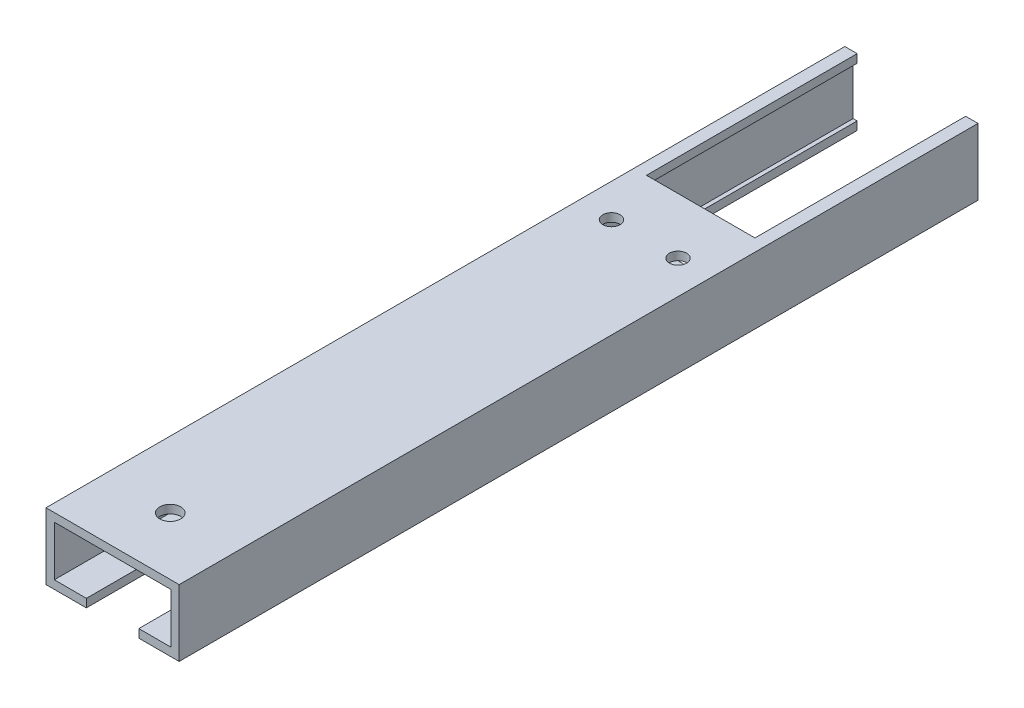
ISO-10303-21;
HEADER;
FILE_DESCRIPTION(('STEP AP214'),'2;1');
FILE_NAME('part.step','',(''),(''),'','','');
FILE_SCHEMA(('AUTOMOTIVE_DESIGN { 1 0 10303 214 1 1 1 1 }'));
ENDSEC;
DATA;
#1=APPLICATION_CONTEXT('core data for automotive mechanical design processes');
#2=APPLICATION_PROTOCOL_DEFINITION('international standard','automotive_design',2000,#1);
#3=PRODUCT_CONTEXT('',#1,'mechanical');
#4=PRODUCT('Part','Part','',(#3));
#5=PRODUCT_RELATED_PRODUCT_CATEGORY('part','',(#4));
#6=PRODUCT_DEFINITION_FORMATION('','',#4);
#7=PRODUCT_DEFINITION_CONTEXT('part definition',#1,'design');
#8=PRODUCT_DEFINITION('design','',#6,#7);
#9=PRODUCT_DEFINITION_SHAPE('','',#8);
#10=(LENGTH_UNIT() NAMED_UNIT(*) SI_UNIT(.MILLI.,.METRE.));
#11=(NAMED_UNIT(*) PLANE_ANGLE_UNIT() SI_UNIT($,.RADIAN.));
#12=(NAMED_UNIT(*) SI_UNIT($,.STERADIAN.) SOLID_ANGLE_UNIT());
#13=UNCERTAINTY_MEASURE_WITH_UNIT(LENGTH_MEASURE(1.E-05),#10,'distance_accuracy_value','');
#14=(GEOMETRIC_REPRESENTATION_CONTEXT(3) GLOBAL_UNCERTAINTY_ASSIGNED_CONTEXT((#13)) GLOBAL_UNIT_ASSIGNED_CONTEXT((#10,
#11,#12)) REPRESENTATION_CONTEXT('',''));
#15=CARTESIAN_POINT('',(0.,0.,0.));
#16=DIRECTION('',(0.,0.,1.));
#17=DIRECTION('',(1.,0.,0.));
#18=AXIS2_PLACEMENT_3D('',#15,#16,#17);
#19=CARTESIAN_POINT('',(0.,0.,0.));
#20=DIRECTION('',(0.,0.,1.));
#21=DIRECTION('',(1.,0.,0.));
#22=AXIS2_PLACEMENT_3D('',#19,#20,#21);
#23=PLANE('',#22);
#24=DIRECTION('',(1.,0.,0.));
#25=VECTOR('',#24,1.);
#26=CARTESIAN_POINT('',(-12.7,-6.35,0.));
#27=LINE('',#26,#25);
#28=CARTESIAN_POINT('',(10.350000001,-6.35,0.));
#29=VERTEX_POINT('',#28);
#30=CARTESIAN_POINT('',(12.7,-6.35,0.));
#31=VERTEX_POINT('',#30);
#32=EDGE_CURVE('E363',#29,#31,#27,.T.);
#33=ORIENTED_EDGE('',*,*,#32,.F.);
#34=DIRECTION('',(0.,-1.,0.));
#35=VECTOR('',#34,1.);
#36=CARTESIAN_POINT('',(10.350000001,6.35,0.));
#37=LINE('',#36,#35);
#38=CARTESIAN_POINT('',(10.350000001,-4.7625,0.));
#39=VERTEX_POINT('',#38);
#40=EDGE_CURVE('E229',#39,#29,#37,.T.);
#41=ORIENTED_EDGE('',*,*,#40,.F.);
#42=DIRECTION('',(1.,0.,0.));
#43=VECTOR('',#42,1.);
#44=CARTESIAN_POINT('',(-11.1125,-4.7625,0.));
#45=LINE('',#44,#43);
#46=CARTESIAN_POINT('',(11.1125,-4.7625,0.));
#47=VERTEX_POINT('',#46);
#48=EDGE_CURVE('E316',#39,#47,#45,.T.);
#49=ORIENTED_EDGE('',*,*,#48,.T.);
#50=DIRECTION('',(0.,1.,0.));
#51=VECTOR('',#50,1.);
#52=CARTESIAN_POINT('',(11.1125,-4.7625,0.));
#53=LINE('',#52,#51);
#54=CARTESIAN_POINT('',(11.1125,4.7625,0.));
#55=VERTEX_POINT('',#54);
#56=EDGE_CURVE('E321',#47,#55,#53,.T.);
#57=ORIENTED_EDGE('',*,*,#56,.T.);
#58=DIRECTION('',(-1.,0.,0.));
#59=VECTOR('',#58,1.);
#60=CARTESIAN_POINT('',(11.1125,4.7625,0.));
#61=LINE('',#60,#59);
#62=CARTESIAN_POINT('',(10.350000001,4.7625,0.));
#63=VERTEX_POINT('',#62);
#64=EDGE_CURVE('E300',#55,#63,#61,.T.);
#65=ORIENTED_EDGE('',*,*,#64,.T.);
#66=CARTESIAN_POINT('',(10.350000001,6.35,0.));
#67=VERTEX_POINT('',#66);
#68=EDGE_CURVE('E225',#67,#63,#37,.T.);
#69=ORIENTED_EDGE('',*,*,#68,.F.);
#70=DIRECTION('',(-1.,0.,0.));
#71=VECTOR('',#70,1.);
#72=CARTESIAN_POINT('',(12.7,6.35,0.));
#73=LINE('',#72,#71);
#74=CARTESIAN_POINT('',(12.7,6.35,0.));
#75=VERTEX_POINT('',#74);
#76=EDGE_CURVE('E207',#75,#67,#73,.T.);
#77=ORIENTED_EDGE('',*,*,#76,.F.);
#78=DIRECTION('',(0.,1.,0.));
#79=VECTOR('',#78,1.);
#80=CARTESIAN_POINT('',(12.7,-6.35,0.));
#81=LINE('',#80,#79);
#82=EDGE_CURVE('E368',#31,#75,#81,.T.);
#83=ORIENTED_EDGE('',*,*,#82,.F.);
#84=EDGE_LOOP('',(#33,#41,#49,#57,#65,#69,#77,#83));
#85=FACE_BOUND('',#84,.T.);
#86=ADVANCED_FACE('F43',(#85),#23,.F.);
#87=CARTESIAN_POINT('',(-11.1125,-4.7625,152.4));
#88=DIRECTION('',(0.,1.,0.));
#89=DIRECTION('',(-1.,0.,0.));
#90=AXIS2_PLACEMENT_3D('',#87,#88,#89);
#91=PLANE('',#90);
#92=CARTESIAN_POINT('',(6.35,-4.7625,50.875));
#93=DIRECTION('',(0.,1.,0.));
#94=DIRECTION('',(-1.,0.,0.));
#95=AXIS2_PLACEMENT_3D('',#92,#93,#94);
#96=CIRCLE('',#95,1.64999999999999);
#97=CARTESIAN_POINT('',(4.70000000000001,-4.7625,50.875));
#98=VERTEX_POINT('',#97);
#99=EDGE_CURVE('E419',#98,#98,#96,.T.);
#100=ORIENTED_EDGE('',*,*,#99,.F.);
#101=EDGE_LOOP('',(#100));
#102=FACE_BOUND('',#101,.T.);
#103=CARTESIAN_POINT('',(-6.35,-4.7625,50.875));
#104=DIRECTION('',(0.,1.,0.));
#105=DIRECTION('',(-1.,0.,0.));
#106=AXIS2_PLACEMENT_3D('',#103,#104,#105);
#107=CIRCLE('',#106,1.64999999999999);
#108=CARTESIAN_POINT('',(-7.99999999999999,-4.7625,50.875));
#109=VERTEX_POINT('',#108);
#110=EDGE_CURVE('E215',#109,#109,#107,.T.);
#111=ORIENTED_EDGE('',*,*,#110,.F.);
#112=EDGE_LOOP('',(#111));
#113=FACE_BOUND('',#112,.T.);
#114=DIRECTION('',(0.,0.,-1.));
#115=VECTOR('',#114,1.);
#116=CARTESIAN_POINT('',(10.350000001,-4.7625,152.4));
#117=LINE('',#116,#115);
#118=CARTESIAN_POINT('',(10.350000001,-4.7625,40.2));
#119=VERTEX_POINT('',#118);
#120=EDGE_CURVE('E242',#119,#39,#117,.T.);
#121=ORIENTED_EDGE('',*,*,#120,.F.);
#122=DIRECTION('',(1.,0.,0.));
#123=VECTOR('',#122,1.);
#124=CARTESIAN_POINT('',(-11.1125,-4.7625,40.2));
#125=LINE('',#124,#123);
#126=CARTESIAN_POINT('',(-10.350000001,-4.7625,40.2));
#127=VERTEX_POINT('',#126);
#128=EDGE_CURVE('E228',#127,#119,#125,.T.);
#129=ORIENTED_EDGE('',*,*,#128,.F.);
#130=DIRECTION('',(0.,0.,1.));
#131=VECTOR('',#130,1.);
#132=CARTESIAN_POINT('',(-10.350000001,-4.7625,152.4));
#133=LINE('',#132,#131);
#134=CARTESIAN_POINT('',(-10.350000001,-4.7625,0.));
#135=VERTEX_POINT('',#134);
#136=EDGE_CURVE('E239',#135,#127,#133,.T.);
#137=ORIENTED_EDGE('',*,*,#136,.F.);
#138=CARTESIAN_POINT('',(-11.1125,-4.7625,0.));
#139=VERTEX_POINT('',#138);
#140=EDGE_CURVE('E317',#139,#135,#45,.T.);
#141=ORIENTED_EDGE('',*,*,#140,.F.);
#142=DIRECTION('',(0.,0.,-1.));
#143=VECTOR('',#142,1.);
#144=CARTESIAN_POINT('',(-11.1125,-4.7625,152.4));
#145=LINE('',#144,#143);
#146=CARTESIAN_POINT('',(-11.1125,-4.7625,152.4));
#147=VERTEX_POINT('',#146);
#148=EDGE_CURVE('E339',#147,#139,#145,.T.);
#149=ORIENTED_EDGE('',*,*,#148,.F.);
#150=DIRECTION('',(1.,0.,0.));
#151=VECTOR('',#150,1.);
#152=CARTESIAN_POINT('',(-11.1125,-4.7625,152.4));
#153=LINE('',#152,#151);
#154=CARTESIAN_POINT('',(-5.00000000000122,-4.76250000000006,152.4));
#155=VERTEX_POINT('',#154);
#156=EDGE_CURVE('E301',#147,#155,#153,.T.);
#157=ORIENTED_EDGE('',*,*,#156,.T.);
#158=DIRECTION('',(0.,0.,-1.));
#159=VECTOR('',#158,1.);
#160=CARTESIAN_POINT('',(-5.00000000000122,-4.7625,152.4));
#161=LINE('',#160,#159);
#162=CARTESIAN_POINT('',(-5.00000000000122,-4.7625,136.400000000001));
#163=VERTEX_POINT('',#162);
#164=EDGE_CURVE('E388',#155,#163,#161,.T.);
#165=ORIENTED_EDGE('',*,*,#164,.T.);
#166=DIRECTION('',(1.,0.,0.));
#167=VECTOR('',#166,1.);
#168=CARTESIAN_POINT('',(-11.1125,-4.7625,136.400000000001));
#169=LINE('',#168,#167);
#170=CARTESIAN_POINT('',(4.99999999999878,-4.76250000000006,136.400000000001));
#171=VERTEX_POINT('',#170);
#172=EDGE_CURVE('E392',#163,#171,#169,.T.);
#173=ORIENTED_EDGE('',*,*,#172,.T.);
#174=DIRECTION('',(0.,0.,1.));
#175=VECTOR('',#174,1.);
#176=CARTESIAN_POINT('',(4.99999999999878,-4.7625,152.4));
#177=LINE('',#176,#175);
#178=CARTESIAN_POINT('',(4.99999999999878,-4.76250000000006,152.4));
#179=VERTEX_POINT('',#178);
#180=EDGE_CURVE('E396',#171,#179,#177,.T.);
#181=ORIENTED_EDGE('',*,*,#180,.T.);
#182=CARTESIAN_POINT('',(11.1125,-4.7625,152.4));
#183=VERTEX_POINT('',#182);
#184=EDGE_CURVE('E299',#179,#183,#153,.T.);
#185=ORIENTED_EDGE('',*,*,#184,.T.);
#186=DIRECTION('',(0.,0.,-1.));
#187=VECTOR('',#186,1.);
#188=CARTESIAN_POINT('',(11.1125,-4.7625,152.4));
#189=LINE('',#188,#187);
#190=EDGE_CURVE('E335',#183,#47,#189,.T.);
#191=ORIENTED_EDGE('',*,*,#190,.T.);
#192=ORIENTED_EDGE('',*,*,#48,.F.);
#193=EDGE_LOOP('',(#121,#129,#137,#141,#149,#157,#165,#173,#181,#185,#191,#192));
#194=FACE_BOUND('',#193,.T.);
#195=CARTESIAN_POINT('',(7.99999999999879,-4.7625,141.400000000001));
#196=DIRECTION('',(0.,1.,0.));
#197=DIRECTION('',(-1.,0.,0.));
#198=AXIS2_PLACEMENT_3D('',#195,#196,#197);
#199=CIRCLE('',#198,1.50041933445692);
#200=CARTESIAN_POINT('',(9.5004193344557,-4.7625,141.400000000001));
#201=VERTEX_POINT('',#200);
#202=EDGE_CURVE('E271',#201,#201,#199,.F.);
#203=ORIENTED_EDGE('',*,*,#202,.T.);
#204=EDGE_LOOP('',(#203));
#205=FACE_BOUND('',#204,.T.);
#206=CARTESIAN_POINT('',(-8.00000000000123,-4.7625,141.400000000001));
#207=DIRECTION('',(0.,1.,0.));
#208=DIRECTION('',(-1.,0.,0.));
#209=AXIS2_PLACEMENT_3D('',#206,#207,#208);
#210=CIRCLE('',#209,1.5004193344569);
#211=CARTESIAN_POINT('',(-6.49958066554433,-4.7625,141.400000000001));
#212=VERTEX_POINT('',#211);
#213=EDGE_CURVE('E276',#212,#212,#210,.F.);
#214=ORIENTED_EDGE('',*,*,#213,.T.);
#215=EDGE_LOOP('',(#214));
#216=FACE_BOUND('',#215,.T.);
#217=ADVANCED_FACE('F457',(#102,#113,#194,#205,#216),#91,.T.);
#218=CARTESIAN_POINT('',(0.,0.,152.4));
#219=DIRECTION('',(0.,0.,1.));
#220=DIRECTION('',(1.,0.,0.));
#221=AXIS2_PLACEMENT_3D('',#218,#219,#220);
#222=PLANE('',#221);
#223=DIRECTION('',(0.,1.,0.));
#224=VECTOR('',#223,1.);
#225=CARTESIAN_POINT('',(4.99999999999879,-200.129070399773,152.4));
#226=LINE('',#225,#224);
#227=CARTESIAN_POINT('',(4.99999999999878,-6.35000000000005,152.4));
#228=VERTEX_POINT('',#227);
#229=EDGE_CURVE('E264',#228,#179,#226,.T.);
#230=ORIENTED_EDGE('',*,*,#229,.F.);
#231=DIRECTION('',(1.,0.,0.));
#232=VECTOR('',#231,1.);
#233=CARTESIAN_POINT('',(-12.7,-6.35,152.4));
#234=LINE('',#233,#232);
#235=CARTESIAN_POINT('',(12.7,-6.35,152.4));
#236=VERTEX_POINT('',#235);
#237=EDGE_CURVE('E348',#228,#236,#234,.T.);
#238=ORIENTED_EDGE('',*,*,#237,.T.);
#239=DIRECTION('',(0.,1.,0.));
#240=VECTOR('',#239,1.);
#241=CARTESIAN_POINT('',(12.7,-6.35,152.4));
#242=LINE('',#241,#240);
#243=CARTESIAN_POINT('',(12.7,6.35,152.4));
#244=VERTEX_POINT('',#243);
#245=EDGE_CURVE('E353',#236,#244,#242,.T.);
#246=ORIENTED_EDGE('',*,*,#245,.T.);
#247=DIRECTION('',(-1.,0.,0.));
#248=VECTOR('',#247,1.);
#249=CARTESIAN_POINT('',(12.7,6.35,152.4));
#250=LINE('',#249,#248);
#251=CARTESIAN_POINT('',(-12.7,6.35,152.4));
#252=VERTEX_POINT('',#251);
#253=EDGE_CURVE('E356',#244,#252,#250,.T.);
#254=ORIENTED_EDGE('',*,*,#253,.T.);
#255=DIRECTION('',(0.,-1.,0.));
#256=VECTOR('',#255,1.);
#257=CARTESIAN_POINT('',(-12.7,6.35,152.4));
#258=LINE('',#257,#256);
#259=CARTESIAN_POINT('',(-12.7,-6.35,152.4));
#260=VERTEX_POINT('',#259);
#261=EDGE_CURVE('E344',#252,#260,#258,.T.);
#262=ORIENTED_EDGE('',*,*,#261,.T.);
#263=CARTESIAN_POINT('',(-5.00000000000122,-6.35000000000005,152.4));
#264=VERTEX_POINT('',#263);
#265=EDGE_CURVE('E349',#260,#264,#234,.T.);
#266=ORIENTED_EDGE('',*,*,#265,.T.);
#267=DIRECTION('',(0.,1.,0.));
#268=VECTOR('',#267,1.);
#269=CARTESIAN_POINT('',(-5.00000000000121,-200.129070399773,152.4));
#270=LINE('',#269,#268);
#271=EDGE_CURVE('E257',#264,#155,#270,.T.);
#272=ORIENTED_EDGE('',*,*,#271,.T.);
#273=ORIENTED_EDGE('',*,*,#156,.F.);
#274=DIRECTION('',(0.,-1.,0.));
#275=VECTOR('',#274,1.);
#276=CARTESIAN_POINT('',(-11.1125,4.7625,152.4));
#277=LINE('',#276,#275);
#278=CARTESIAN_POINT('',(-11.1125,4.7625,152.4));
#279=VERTEX_POINT('',#278);
#280=EDGE_CURVE('E296',#279,#147,#277,.T.);
#281=ORIENTED_EDGE('',*,*,#280,.F.);
#282=DIRECTION('',(-1.,0.,0.));
#283=VECTOR('',#282,1.);
#284=CARTESIAN_POINT('',(11.1125,4.7625,152.4));
#285=LINE('',#284,#283);
#286=CARTESIAN_POINT('',(11.1125,4.7625,152.4));
#287=VERTEX_POINT('',#286);
#288=EDGE_CURVE('E309',#287,#279,#285,.T.);
#289=ORIENTED_EDGE('',*,*,#288,.F.);
#290=DIRECTION('',(0.,1.,0.));
#291=VECTOR('',#290,1.);
#292=CARTESIAN_POINT('',(11.1125,-4.7625,152.4));
#293=LINE('',#292,#291);
#294=EDGE_CURVE('E305',#183,#287,#293,.T.);
#295=ORIENTED_EDGE('',*,*,#294,.F.);
#296=ORIENTED_EDGE('',*,*,#184,.F.);
#297=EDGE_LOOP('',(#230,#238,#246,#254,#262,#266,#272,#273,#281,#289,#295,#296));
#298=FACE_BOUND('',#297,.T.);
#299=ADVANCED_FACE('F460',(#298),#222,.T.);
#300=CARTESIAN_POINT('',(-10.350000001,6.35,0.));
#301=VERTEX_POINT('',#300);
#302=CARTESIAN_POINT('',(-12.7,6.35,0.));
#303=VERTEX_POINT('',#302);
#304=EDGE_CURVE('E371',#301,#303,#73,.T.);
#305=ORIENTED_EDGE('',*,*,#304,.F.);
#306=DIRECTION('',(0.,-1.,0.));
#307=VECTOR('',#306,1.);
#308=CARTESIAN_POINT('',(-10.350000001,6.35,0.));
#309=LINE('',#308,#307);
#310=CARTESIAN_POINT('',(-10.350000001,4.7625,0.));
#311=VERTEX_POINT('',#310);
#312=EDGE_CURVE('E230',#301,#311,#309,.T.);
#313=ORIENTED_EDGE('',*,*,#312,.T.);
#314=CARTESIAN_POINT('',(-11.1125,4.7625,0.));
#315=VERTEX_POINT('',#314);
#316=EDGE_CURVE('E325',#311,#315,#61,.T.);
#317=ORIENTED_EDGE('',*,*,#316,.T.);
#318=DIRECTION('',(0.,-1.,0.));
#319=VECTOR('',#318,1.);
#320=CARTESIAN_POINT('',(-11.1125,4.7625,0.));
#321=LINE('',#320,#319);
#322=EDGE_CURVE('E295',#315,#139,#321,.T.);
#323=ORIENTED_EDGE('',*,*,#322,.T.);
#324=ORIENTED_EDGE('',*,*,#140,.T.);
#325=CARTESIAN_POINT('',(-10.350000001,-6.35,0.));
#326=VERTEX_POINT('',#325);
#327=EDGE_CURVE('E234',#135,#326,#309,.T.);
#328=ORIENTED_EDGE('',*,*,#327,.T.);
#329=CARTESIAN_POINT('',(-12.7,-6.35,0.));
#330=VERTEX_POINT('',#329);
#331=EDGE_CURVE('E364',#330,#326,#27,.T.);
#332=ORIENTED_EDGE('',*,*,#331,.F.);
#333=DIRECTION('',(0.,-1.,0.));
#334=VECTOR('',#333,1.);
#335=CARTESIAN_POINT('',(-12.7,6.35,0.));
#336=LINE('',#335,#334);
#337=EDGE_CURVE('E343',#303,#330,#336,.T.);
#338=ORIENTED_EDGE('',*,*,#337,.F.);
#339=EDGE_LOOP('',(#305,#313,#317,#323,#324,#328,#332,#338));
#340=FACE_BOUND('',#339,.T.);
#341=ADVANCED_FACE('F478',(#340),#23,.F.);
#342=CARTESIAN_POINT('',(-12.7,6.35,152.4));
#343=DIRECTION('',(1.,0.,0.));
#344=DIRECTION('',(0.,0.,-1.));
#345=AXIS2_PLACEMENT_3D('',#342,#343,#344);
#346=PLANE('',#345);
#347=ORIENTED_EDGE('',*,*,#337,.T.);
#348=DIRECTION('',(0.,0.,-1.));
#349=VECTOR('',#348,1.);
#350=CARTESIAN_POINT('',(-12.7,-6.35,152.4));
#351=LINE('',#350,#349);
#352=EDGE_CURVE('E384',#260,#330,#351,.T.);
#353=ORIENTED_EDGE('',*,*,#352,.F.);
#354=ORIENTED_EDGE('',*,*,#261,.F.);
#355=DIRECTION('',(0.,0.,-1.));
#356=VECTOR('',#355,1.);
#357=CARTESIAN_POINT('',(-12.7,6.35,152.4));
#358=LINE('',#357,#356);
#359=EDGE_CURVE('E359',#252,#303,#358,.T.);
#360=ORIENTED_EDGE('',*,*,#359,.T.);
#361=EDGE_LOOP('',(#347,#353,#354,#360));
#362=FACE_BOUND('',#361,.T.);
#363=ADVANCED_FACE('F45',(#362),#346,.F.);
#364=CARTESIAN_POINT('',(-12.7,-6.35,152.4));
#365=DIRECTION('',(0.,1.,0.));
#366=DIRECTION('',(-1.,0.,0.));
#367=AXIS2_PLACEMENT_3D('',#364,#365,#366);
#368=PLANE('',#367);
#369=CARTESIAN_POINT('',(6.35,-6.35,50.875));
#370=DIRECTION('',(0.,-1.,0.));
#371=DIRECTION('',(0.,0.,-1.));
#372=AXIS2_PLACEMENT_3D('',#369,#370,#371);
#373=CIRCLE('',#372,1.64999999999999);
#374=CARTESIAN_POINT('',(6.35,-6.35,49.225));
#375=VERTEX_POINT('',#374);
#376=EDGE_CURVE('E429',#375,#375,#373,.T.);
#377=ORIENTED_EDGE('',*,*,#376,.F.);
#378=EDGE_LOOP('',(#377));
#379=FACE_BOUND('',#378,.T.);
#380=CARTESIAN_POINT('',(-6.35,-6.35,50.875));
#381=DIRECTION('',(0.,-1.,0.));
#382=DIRECTION('',(0.,0.,-1.));
#383=AXIS2_PLACEMENT_3D('',#380,#381,#382);
#384=CIRCLE('',#383,1.64999999999999);
#385=CARTESIAN_POINT('',(-6.35,-6.35,49.225));
#386=VERTEX_POINT('',#385);
#387=EDGE_CURVE('E414',#386,#386,#384,.T.);
#388=ORIENTED_EDGE('',*,*,#387,.F.);
#389=EDGE_LOOP('',(#388));
#390=FACE_BOUND('',#389,.T.);
#391=DIRECTION('',(-1.,0.,0.));
#392=VECTOR('',#391,1.);
#393=CARTESIAN_POINT('',(-10.350000001,-6.35,40.2));
#394=LINE('',#393,#392);
#395=CARTESIAN_POINT('',(10.350000001,-6.35,40.2));
#396=VERTEX_POINT('',#395);
#397=CARTESIAN_POINT('',(-10.350000001,-6.35,40.2));
#398=VERTEX_POINT('',#397);
#399=EDGE_CURVE('E212',#396,#398,#394,.T.);
#400=ORIENTED_EDGE('',*,*,#399,.F.);
#401=DIRECTION('',(0.,0.,1.));
#402=VECTOR('',#401,1.);
#403=CARTESIAN_POINT('',(10.350000001,-6.35,40.2));
#404=LINE('',#403,#402);
#405=EDGE_CURVE('E61',#29,#396,#404,.T.);
#406=ORIENTED_EDGE('',*,*,#405,.F.);
#407=ORIENTED_EDGE('',*,*,#32,.T.);
#408=DIRECTION('',(0.,0.,-1.));
#409=VECTOR('',#408,1.);
#410=CARTESIAN_POINT('',(12.7,-6.35,152.4));
#411=LINE('',#410,#409);
#412=EDGE_CURVE('E380',#236,#31,#411,.T.);
#413=ORIENTED_EDGE('',*,*,#412,.F.);
#414=ORIENTED_EDGE('',*,*,#237,.F.);
#415=DIRECTION('',(0.,0.,-1.));
#416=VECTOR('',#415,1.);
#417=CARTESIAN_POINT('',(4.99999999999878,-6.34999999999999,136.400000000001));
#418=LINE('',#417,#416);
#419=CARTESIAN_POINT('',(4.99999999999878,-6.35000000000005,136.400000000001));
#420=VERTEX_POINT('',#419);
#421=EDGE_CURVE('E245',#228,#420,#418,.T.);
#422=ORIENTED_EDGE('',*,*,#421,.T.);
#423=DIRECTION('',(-1.,0.,0.));
#424=VECTOR('',#423,1.);
#425=CARTESIAN_POINT('',(-5.00000000000122,-6.34999999999999,136.400000000001));
#426=LINE('',#425,#424);
#427=CARTESIAN_POINT('',(-5.00000000000122,-6.35000000000005,136.400000000001));
#428=VERTEX_POINT('',#427);
#429=EDGE_CURVE('E249',#420,#428,#426,.T.);
#430=ORIENTED_EDGE('',*,*,#429,.T.);
#431=DIRECTION('',(0.,0.,1.));
#432=VECTOR('',#431,1.);
#433=CARTESIAN_POINT('',(-5.00000000000122,-6.34999999999999,152.4));
#434=LINE('',#433,#432);
#435=EDGE_CURVE('E253',#428,#264,#434,.T.);
#436=ORIENTED_EDGE('',*,*,#435,.T.);
#437=ORIENTED_EDGE('',*,*,#265,.F.);
#438=ORIENTED_EDGE('',*,*,#352,.T.);
#439=ORIENTED_EDGE('',*,*,#331,.T.);
#440=DIRECTION('',(0.,0.,-1.));
#441=VECTOR('',#440,1.);
#442=CARTESIAN_POINT('',(-10.350000001,-6.35,40.2));
#443=LINE('',#442,#441);
#444=EDGE_CURVE('E209',#398,#326,#443,.T.);
#445=ORIENTED_EDGE('',*,*,#444,.F.);
#446=EDGE_LOOP('',(#400,#406,#407,#413,#414,#422,#430,#436,#437,#438,#439,#445));
#447=FACE_BOUND('',#446,.T.);
#448=CARTESIAN_POINT('',(-8.00000000000123,-6.35,141.400000000001));
#449=DIRECTION('',(0.,-1.,0.));
#450=DIRECTION('',(1.,0.,0.));
#451=AXIS2_PLACEMENT_3D('',#448,#449,#450);
#452=CIRCLE('',#451,1.5004193344569);
#453=CARTESIAN_POINT('',(-6.49958066554433,-6.35,141.400000000001));
#454=VERTEX_POINT('',#453);
#455=EDGE_CURVE('E272',#454,#454,#452,.T.);
#456=ORIENTED_EDGE('',*,*,#455,.F.);
#457=EDGE_LOOP('',(#456));
#458=FACE_BOUND('',#457,.T.);
#459=CARTESIAN_POINT('',(7.99999999999879,-6.35,141.400000000001));
#460=DIRECTION('',(0.,-1.,0.));
#461=DIRECTION('',(1.,0.,0.));
#462=AXIS2_PLACEMENT_3D('',#459,#460,#461);
#463=CIRCLE('',#462,1.50041933445692);
#464=CARTESIAN_POINT('',(9.5004193344557,-6.35,141.400000000001));
#465=VERTEX_POINT('',#464);
#466=EDGE_CURVE('E277',#465,#465,#463,.T.);
#467=ORIENTED_EDGE('',*,*,#466,.F.);
#468=EDGE_LOOP('',(#467));
#469=FACE_BOUND('',#468,.T.);
#470=ADVANCED_FACE('F436',(#379,#390,#447,#458,#469),#368,.F.);
#471=CARTESIAN_POINT('',(12.7,-6.35,152.4));
#472=DIRECTION('',(-1.,0.,0.));
#473=DIRECTION('',(0.,0.,1.));
#474=AXIS2_PLACEMENT_3D('',#471,#472,#473);
#475=PLANE('',#474);
#476=ORIENTED_EDGE('',*,*,#82,.T.);
#477=DIRECTION('',(0.,0.,-1.));
#478=VECTOR('',#477,1.);
#479=CARTESIAN_POINT('',(12.7,6.35,152.4));
#480=LINE('',#479,#478);
#481=EDGE_CURVE('E377',#244,#75,#480,.T.);
#482=ORIENTED_EDGE('',*,*,#481,.F.);
#483=ORIENTED_EDGE('',*,*,#245,.F.);
#484=ORIENTED_EDGE('',*,*,#412,.T.);
#485=EDGE_LOOP('',(#476,#482,#483,#484));
#486=FACE_BOUND('',#485,.T.);
#487=ADVANCED_FACE('F439',(#486),#475,.F.);
#488=CARTESIAN_POINT('',(12.7,6.35,152.4));
#489=DIRECTION('',(0.,-1.,0.));
#490=DIRECTION('',(0.,0.,-1.));
#491=AXIS2_PLACEMENT_3D('',#488,#489,#490);
#492=PLANE('',#491);
#493=CARTESIAN_POINT('',(6.35,6.35,50.875));
#494=DIRECTION('',(0.,-1.,0.));
#495=DIRECTION('',(0.,0.,-1.));
#496=AXIS2_PLACEMENT_3D('',#493,#494,#495);
#497=CIRCLE('',#496,1.65);
#498=CARTESIAN_POINT('',(6.35,6.35,49.225));
#499=VERTEX_POINT('',#498);
#500=EDGE_CURVE('E425',#499,#499,#497,.T.);
#501=ORIENTED_EDGE('',*,*,#500,.T.);
#502=EDGE_LOOP('',(#501));
#503=FACE_BOUND('',#502,.T.);
#504=CARTESIAN_POINT('',(-6.35,6.35,50.875));
#505=DIRECTION('',(0.,-1.,0.));
#506=DIRECTION('',(0.,0.,-1.));
#507=AXIS2_PLACEMENT_3D('',#504,#505,#506);
#508=CIRCLE('',#507,1.65);
#509=CARTESIAN_POINT('',(-6.35,6.35,49.225));
#510=VERTEX_POINT('',#509);
#511=EDGE_CURVE('E407',#510,#510,#508,.T.);
#512=ORIENTED_EDGE('',*,*,#511,.T.);
#513=EDGE_LOOP('',(#512));
#514=FACE_BOUND('',#513,.T.);
#515=ORIENTED_EDGE('',*,*,#76,.T.);
#516=DIRECTION('',(0.,0.,1.));
#517=VECTOR('',#516,1.);
#518=CARTESIAN_POINT('',(10.350000001,6.35,40.2));
#519=LINE('',#518,#517);
#520=CARTESIAN_POINT('',(10.350000001,6.35,40.2));
#521=VERTEX_POINT('',#520);
#522=EDGE_CURVE('E183',#67,#521,#519,.T.);
#523=ORIENTED_EDGE('',*,*,#522,.T.);
#524=DIRECTION('',(-1.,0.,0.));
#525=VECTOR('',#524,1.);
#526=CARTESIAN_POINT('',(-10.350000001,6.35,40.2));
#527=LINE('',#526,#525);
#528=CARTESIAN_POINT('',(-10.350000001,6.35,40.2));
#529=VERTEX_POINT('',#528);
#530=EDGE_CURVE('E192',#521,#529,#527,.T.);
#531=ORIENTED_EDGE('',*,*,#530,.T.);
#532=DIRECTION('',(0.,0.,-1.));
#533=VECTOR('',#532,1.);
#534=CARTESIAN_POINT('',(-10.350000001,6.35,40.2));
#535=LINE('',#534,#533);
#536=EDGE_CURVE('E200',#529,#301,#535,.T.);
#537=ORIENTED_EDGE('',*,*,#536,.T.);
#538=ORIENTED_EDGE('',*,*,#304,.T.);
#539=ORIENTED_EDGE('',*,*,#359,.F.);
#540=ORIENTED_EDGE('',*,*,#253,.F.);
#541=ORIENTED_EDGE('',*,*,#481,.T.);
#542=EDGE_LOOP('',(#515,#523,#531,#537,#538,#539,#540,#541));
#543=FACE_BOUND('',#542,.T.);
#544=CARTESIAN_POINT('',(-2.24848308471093E-12,6.35,141.400000000001));
#545=DIRECTION('',(0.,1.,0.));
#546=DIRECTION('',(0.,0.,1.));
#547=AXIS2_PLACEMENT_3D('',#544,#545,#546);
#548=CIRCLE('',#547,2.);
#549=CARTESIAN_POINT('',(-2.24848308471093E-12,6.35,143.400000000001));
#550=VERTEX_POINT('',#549);
#551=EDGE_CURVE('E281',#550,#550,#548,.T.);
#552=ORIENTED_EDGE('',*,*,#551,.F.);
#553=EDGE_LOOP('',(#552));
#554=FACE_BOUND('',#553,.T.);
#555=ADVANCED_FACE('F203',(#503,#514,#543,#554),#492,.F.);
#556=CARTESIAN_POINT('',(-11.1125,4.7625,152.4));
#557=DIRECTION('',(1.,0.,0.));
#558=DIRECTION('',(0.,1.,0.));
#559=AXIS2_PLACEMENT_3D('',#556,#557,#558);
#560=PLANE('',#559);
#561=ORIENTED_EDGE('',*,*,#322,.F.);
#562=DIRECTION('',(0.,0.,-1.));
#563=VECTOR('',#562,1.);
#564=CARTESIAN_POINT('',(-11.1125,4.7625,152.4));
#565=LINE('',#564,#563);
#566=EDGE_CURVE('E312',#279,#315,#565,.T.);
#567=ORIENTED_EDGE('',*,*,#566,.F.);
#568=ORIENTED_EDGE('',*,*,#280,.T.);
#569=ORIENTED_EDGE('',*,*,#148,.T.);
#570=EDGE_LOOP('',(#561,#567,#568,#569));
#571=FACE_BOUND('',#570,.T.);
#572=ADVANCED_FACE('F553',(#571),#560,.T.);
#573=CARTESIAN_POINT('',(11.1125,-4.7625,152.4));
#574=DIRECTION('',(-1.,0.,0.));
#575=DIRECTION('',(0.,-1.,0.));
#576=AXIS2_PLACEMENT_3D('',#573,#574,#575);
#577=PLANE('',#576);
#578=ORIENTED_EDGE('',*,*,#56,.F.);
#579=ORIENTED_EDGE('',*,*,#190,.F.);
#580=ORIENTED_EDGE('',*,*,#294,.T.);
#581=DIRECTION('',(0.,0.,-1.));
#582=VECTOR('',#581,1.);
#583=CARTESIAN_POINT('',(11.1125,4.7625,152.4));
#584=LINE('',#583,#582);
#585=EDGE_CURVE('E332',#287,#55,#584,.T.);
#586=ORIENTED_EDGE('',*,*,#585,.T.);
#587=EDGE_LOOP('',(#578,#579,#580,#586));
#588=FACE_BOUND('',#587,.T.);
#589=ADVANCED_FACE('F569',(#588),#577,.T.);
#590=CARTESIAN_POINT('',(11.1125,4.7625,152.4));
#591=DIRECTION('',(0.,-1.,0.));
#592=DIRECTION('',(0.,0.,-1.));
#593=AXIS2_PLACEMENT_3D('',#590,#591,#592);
#594=PLANE('',#593);
#595=CARTESIAN_POINT('',(6.35,4.7625,50.875));
#596=DIRECTION('',(0.,-1.,0.));
#597=DIRECTION('',(0.,0.,-1.));
#598=AXIS2_PLACEMENT_3D('',#595,#596,#597);
#599=CIRCLE('',#598,1.64999999999999);
#600=CARTESIAN_POINT('',(6.35,4.7625,49.225));
#601=VERTEX_POINT('',#600);
#602=EDGE_CURVE('E47',#601,#601,#599,.T.);
#603=ORIENTED_EDGE('',*,*,#602,.F.);
#604=EDGE_LOOP('',(#603));
#605=FACE_BOUND('',#604,.T.);
#606=CARTESIAN_POINT('',(-6.35,4.7625,50.875));
#607=DIRECTION('',(0.,-1.,0.));
#608=DIRECTION('',(0.,0.,-1.));
#609=AXIS2_PLACEMENT_3D('',#606,#607,#608);
#610=CIRCLE('',#609,1.64999999999999);
#611=CARTESIAN_POINT('',(-6.35,4.7625,49.225));
#612=VERTEX_POINT('',#611);
#613=EDGE_CURVE('E404',#612,#612,#610,.T.);
#614=ORIENTED_EDGE('',*,*,#613,.F.);
#615=EDGE_LOOP('',(#614));
#616=FACE_BOUND('',#615,.T.);
#617=DIRECTION('',(0.,0.,1.));
#618=VECTOR('',#617,1.);
#619=CARTESIAN_POINT('',(10.350000001,4.7625,152.4));
#620=LINE('',#619,#618);
#621=CARTESIAN_POINT('',(10.350000001,4.7625,40.2));
#622=VERTEX_POINT('',#621);
#623=EDGE_CURVE('E11',#63,#622,#620,.T.);
#624=ORIENTED_EDGE('',*,*,#623,.F.);
#625=ORIENTED_EDGE('',*,*,#64,.F.);
#626=ORIENTED_EDGE('',*,*,#585,.F.);
#627=ORIENTED_EDGE('',*,*,#288,.T.);
#628=ORIENTED_EDGE('',*,*,#566,.T.);
#629=ORIENTED_EDGE('',*,*,#316,.F.);
#630=DIRECTION('',(0.,0.,-1.));
#631=VECTOR('',#630,1.);
#632=CARTESIAN_POINT('',(-10.350000001,4.7625,152.4));
#633=LINE('',#632,#631);
#634=CARTESIAN_POINT('',(-10.350000001,4.7625,40.2));
#635=VERTEX_POINT('',#634);
#636=EDGE_CURVE('E53',#635,#311,#633,.T.);
#637=ORIENTED_EDGE('',*,*,#636,.F.);
#638=DIRECTION('',(-1.,0.,0.));
#639=VECTOR('',#638,1.);
#640=CARTESIAN_POINT('',(11.1125,4.7625,40.2));
#641=LINE('',#640,#639);
#642=EDGE_CURVE('E400',#622,#635,#641,.T.);
#643=ORIENTED_EDGE('',*,*,#642,.F.);
#644=EDGE_LOOP('',(#624,#625,#626,#627,#628,#629,#637,#643));
#645=FACE_BOUND('',#644,.T.);
#646=CARTESIAN_POINT('',(-2.24848308471093E-12,4.7625,141.400000000001));
#647=DIRECTION('',(0.,-1.,0.));
#648=DIRECTION('',(0.,0.,-1.));
#649=AXIS2_PLACEMENT_3D('',#646,#647,#648);
#650=CIRCLE('',#649,2.);
#651=CARTESIAN_POINT('',(-2.24848308471093E-12,4.7625,139.400000000001));
#652=VERTEX_POINT('',#651);
#653=EDGE_CURVE('E291',#652,#652,#650,.F.);
#654=ORIENTED_EDGE('',*,*,#653,.T.);
#655=EDGE_LOOP('',(#654));
#656=FACE_BOUND('',#655,.T.);
#657=ADVANCED_FACE('F526',(#605,#616,#645,#656),#594,.T.);
#658=CARTESIAN_POINT('',(-2.24848308471093E-12,-0.894354249492388,141.400000000001));
#659=DIRECTION('',(0.,1.,0.));
#660=DIRECTION('',(0.,0.,1.));
#661=AXIS2_PLACEMENT_3D('',#658,#659,#660);
#662=CYLINDRICAL_SURFACE('',#661,2.);
#663=ORIENTED_EDGE('',*,*,#551,.T.);
#664=EDGE_LOOP('',(#663));
#665=FACE_BOUND('',#664,.T.);
#666=ORIENTED_EDGE('',*,*,#653,.F.);
#667=EDGE_LOOP('',(#666));
#668=FACE_BOUND('',#667,.T.);
#669=ADVANCED_FACE('F453',(#665,#668),#662,.F.);
#670=CARTESIAN_POINT('',(7.99999999999879,-0.518673255928433,141.400000000001));
#671=DIRECTION('',(0.,-1.,0.));
#672=DIRECTION('',(1.,0.,0.));
#673=AXIS2_PLACEMENT_3D('',#670,#671,#672);
#674=CYLINDRICAL_SURFACE('',#673,1.50041933445692);
#675=CARTESIAN_POINT('',(9.5004193344557,-6.35,141.400000000001));
#676=CARTESIAN_POINT('',(9.5004193344557,-6.33346354166666,141.400000000001));
#677=CARTESIAN_POINT('',(9.5004193344557,-6.31692708333333,141.400000000001));
#678=CARTESIAN_POINT('',(9.5004193344557,-6.28385416666667,141.400000000001));
#679=CARTESIAN_POINT('',(9.5004193344557,-6.26731770833333,141.400000000001));
#680=CARTESIAN_POINT('',(9.5004193344557,-6.23424479166666,141.400000000001));
#681=CARTESIAN_POINT('',(9.5004193344557,-6.21770833333333,141.400000000001));
#682=CARTESIAN_POINT('',(9.5004193344557,-6.18463541666666,141.400000000001));
#683=CARTESIAN_POINT('',(9.5004193344557,-6.16809895833333,141.400000000001));
#684=CARTESIAN_POINT('',(9.5004193344557,-6.13502604166666,141.400000000001));
#685=CARTESIAN_POINT('',(9.5004193344557,-6.11848958333333,141.400000000001));
#686=CARTESIAN_POINT('',(9.5004193344557,-6.08541666666666,141.400000000001));
#687=CARTESIAN_POINT('',(9.5004193344557,-6.06888020833333,141.400000000001));
#688=CARTESIAN_POINT('',(9.5004193344557,-6.03580729166666,141.400000000001));
#689=CARTESIAN_POINT('',(9.5004193344557,-6.01927083333333,141.400000000001));
#690=CARTESIAN_POINT('',(9.5004193344557,-5.98619791666667,141.400000000001));
#691=CARTESIAN_POINT('',(9.5004193344557,-5.96966145833333,141.400000000001));
#692=CARTESIAN_POINT('',(9.5004193344557,-5.93658854166666,141.400000000001));
#693=CARTESIAN_POINT('',(9.5004193344557,-5.92005208333333,141.400000000001));
#694=CARTESIAN_POINT('',(9.5004193344557,-5.88697916666666,141.400000000001));
#695=CARTESIAN_POINT('',(9.5004193344557,-5.87044270833333,141.400000000001));
#696=CARTESIAN_POINT('',(9.5004193344557,-5.83736979166666,141.400000000001));
#697=CARTESIAN_POINT('',(9.5004193344557,-5.82083333333333,141.400000000001));
#698=CARTESIAN_POINT('',(9.5004193344557,-5.78776041666667,141.400000000001));
#699=CARTESIAN_POINT('',(9.5004193344557,-5.77122395833333,141.400000000001));
#700=CARTESIAN_POINT('',(9.5004193344557,-5.73815104166666,141.400000000001));
#701=CARTESIAN_POINT('',(9.5004193344557,-5.72161458333333,141.400000000001));
#702=CARTESIAN_POINT('',(9.5004193344557,-5.68854166666666,141.400000000001));
#703=CARTESIAN_POINT('',(9.5004193344557,-5.67200520833333,141.400000000001));
#704=CARTESIAN_POINT('',(9.5004193344557,-5.63893229166666,141.400000000001));
#705=CARTESIAN_POINT('',(9.5004193344557,-5.62239583333333,141.400000000001));
#706=CARTESIAN_POINT('',(9.5004193344557,-5.58932291666666,141.400000000001));
#707=CARTESIAN_POINT('',(9.5004193344557,-5.57278645833333,141.400000000001));
#708=CARTESIAN_POINT('',(9.5004193344557,-5.53971354166666,141.400000000001));
#709=CARTESIAN_POINT('',(9.5004193344557,-5.52317708333333,141.400000000001));
#710=CARTESIAN_POINT('',(9.5004193344557,-5.49010416666667,141.400000000001));
#711=CARTESIAN_POINT('',(9.5004193344557,-5.47356770833333,141.400000000001));
#712=CARTESIAN_POINT('',(9.5004193344557,-5.44049479166666,141.400000000001));
#713=CARTESIAN_POINT('',(9.5004193344557,-5.42395833333333,141.400000000001));
#714=CARTESIAN_POINT('',(9.5004193344557,-5.39088541666666,141.400000000001));
#715=CARTESIAN_POINT('',(9.5004193344557,-5.37434895833333,141.400000000001));
#716=CARTESIAN_POINT('',(9.5004193344557,-5.34127604166666,141.400000000001));
#717=CARTESIAN_POINT('',(9.5004193344557,-5.32473958333333,141.400000000001));
#718=CARTESIAN_POINT('',(9.5004193344557,-5.29166666666666,141.400000000001));
#719=CARTESIAN_POINT('',(9.5004193344557,-5.27513020833333,141.400000000001));
#720=CARTESIAN_POINT('',(9.5004193344557,-5.24205729166666,141.400000000001));
#721=CARTESIAN_POINT('',(9.5004193344557,-5.22552083333333,141.400000000001));
#722=CARTESIAN_POINT('',(9.5004193344557,-5.19244791666666,141.400000000001));
#723=CARTESIAN_POINT('',(9.5004193344557,-5.17591145833333,141.400000000001));
#724=CARTESIAN_POINT('',(9.5004193344557,-5.14283854166666,141.400000000001));
#725=CARTESIAN_POINT('',(9.5004193344557,-5.12630208333333,141.400000000001));
#726=CARTESIAN_POINT('',(9.5004193344557,-5.09322916666666,141.400000000001));
#727=CARTESIAN_POINT('',(9.5004193344557,-5.07669270833333,141.400000000001));
#728=CARTESIAN_POINT('',(9.5004193344557,-5.04361979166666,141.400000000001));
#729=CARTESIAN_POINT('',(9.5004193344557,-5.02708333333333,141.400000000001));
#730=CARTESIAN_POINT('',(9.5004193344557,-4.99401041666666,141.400000000001));
#731=CARTESIAN_POINT('',(9.5004193344557,-4.97747395833333,141.400000000001));
#732=CARTESIAN_POINT('',(9.5004193344557,-4.94440104166666,141.400000000001));
#733=CARTESIAN_POINT('',(9.5004193344557,-4.92786458333333,141.400000000001));
#734=CARTESIAN_POINT('',(9.5004193344557,-4.89479166666666,141.400000000001));
#735=CARTESIAN_POINT('',(9.5004193344557,-4.87825520833333,141.400000000001));
#736=CARTESIAN_POINT('',(9.5004193344557,-4.84518229166666,141.400000000001));
#737=CARTESIAN_POINT('',(9.5004193344557,-4.82864583333333,141.400000000001));
#738=CARTESIAN_POINT('',(9.5004193344557,-4.79557291666666,141.400000000001));
#739=CARTESIAN_POINT('',(9.5004193344557,-4.77903645833333,141.400000000001));
#740=CARTESIAN_POINT('',(9.5004193344557,-4.7625,141.400000000001));
#741=B_SPLINE_CURVE_WITH_KNOTS('',3,(#675,#676,#677,#678,#679,#680,#681,#682,#683,#684,#685,
#686,#687,#688,#689,#690,#691,#692,#693,#694,#695,#696,#697,#698,#699,#700,#701,#702,#703,#704,
#705,#706,#707,#708,#709,#710,#711,#712,#713,#714,#715,#716,#717,#718,#719,#720,#721,#722,#723,
#724,#725,#726,#727,#728,#729,#730,#731,#732,#733,#734,#735,#736,#737,#738,#739,#740),
.UNSPECIFIED.,.F.,.F.,(4,2,2,2,2,2,2,2,2,2,2,2,2,2,2,2,2,2,2,2,2,2,2,2,2,2,2,2,2,2,2,2,4),(0.,
0.0496093749999997,0.0992187500000004,0.148828125,0.1984375,0.248046875,0.29765625,0.347265625,
0.396875,0.446484375,0.49609375,0.545703125,0.5953125,0.644921875,0.69453125,0.744140625,
0.79375,0.843359375,0.892968750000001,0.942578125,0.9921875,1.041796875,1.09140625,1.141015625,
1.190625,1.240234375,1.28984375,1.339453125,1.3890625,1.438671875,1.48828125,1.537890625,
1.5875),.UNSPECIFIED.);
#742=EDGE_CURVE('BSEAM449',#465,#201,#741,.T.);
#743=ORIENTED_EDGE('',*,*,#466,.T.);
#744=ORIENTED_EDGE('',*,*,#202,.F.);
#745=ORIENTED_EDGE('',*,*,#742,.T.);
#746=ORIENTED_EDGE('',*,*,#742,.F.);
#747=EDGE_LOOP('',(#743,#745,#744,#746));
#748=FACE_BOUND('',#747,.T.);
#749=ADVANCED_FACE('F449',(#748),#674,.F.);
#750=CARTESIAN_POINT('',(-8.00000000000123,-0.518673255928435,141.400000000001));
#751=DIRECTION('',(0.,-1.,0.));
#752=DIRECTION('',(1.,0.,0.));
#753=AXIS2_PLACEMENT_3D('',#750,#751,#752);
#754=CYLINDRICAL_SURFACE('',#753,1.5004193344569);
#755=CARTESIAN_POINT('',(-6.49958066554433,-6.35,141.400000000001));
#756=CARTESIAN_POINT('',(-6.49958066554433,-6.33346354166667,141.400000000001));
#757=CARTESIAN_POINT('',(-6.49958066554433,-6.31692708333333,141.400000000001));
#758=CARTESIAN_POINT('',(-6.49958066554433,-6.28385416666667,141.400000000001));
#759=CARTESIAN_POINT('',(-6.49958066554433,-6.26731770833333,141.400000000001));
#760=CARTESIAN_POINT('',(-6.49958066554433,-6.23424479166667,141.400000000001));
#761=CARTESIAN_POINT('',(-6.49958066554433,-6.21770833333333,141.400000000001));
#762=CARTESIAN_POINT('',(-6.49958066554433,-6.18463541666667,141.400000000001));
#763=CARTESIAN_POINT('',(-6.49958066554433,-6.16809895833333,141.400000000001));
#764=CARTESIAN_POINT('',(-6.49958066554433,-6.13502604166667,141.400000000001));
#765=CARTESIAN_POINT('',(-6.49958066554433,-6.11848958333333,141.400000000001));
#766=CARTESIAN_POINT('',(-6.49958066554433,-6.08541666666667,141.400000000001));
#767=CARTESIAN_POINT('',(-6.49958066554433,-6.06888020833333,141.400000000001));
#768=CARTESIAN_POINT('',(-6.49958066554433,-6.03580729166667,141.400000000001));
#769=CARTESIAN_POINT('',(-6.49958066554433,-6.01927083333333,141.400000000001));
#770=CARTESIAN_POINT('',(-6.49958066554433,-5.98619791666667,141.400000000001));
#771=CARTESIAN_POINT('',(-6.49958066554433,-5.96966145833333,141.400000000001));
#772=CARTESIAN_POINT('',(-6.49958066554433,-5.93658854166667,141.400000000001));
#773=CARTESIAN_POINT('',(-6.49958066554433,-5.92005208333333,141.400000000001));
#774=CARTESIAN_POINT('',(-6.49958066554433,-5.88697916666667,141.400000000001));
#775=CARTESIAN_POINT('',(-6.49958066554433,-5.87044270833333,141.400000000001));
#776=CARTESIAN_POINT('',(-6.49958066554433,-5.83736979166667,141.400000000001));
#777=CARTESIAN_POINT('',(-6.49958066554433,-5.82083333333333,141.400000000001));
#778=CARTESIAN_POINT('',(-6.49958066554433,-5.78776041666667,141.400000000001));
#779=CARTESIAN_POINT('',(-6.49958066554433,-5.77122395833333,141.400000000001));
#780=CARTESIAN_POINT('',(-6.49958066554433,-5.73815104166667,141.400000000001));
#781=CARTESIAN_POINT('',(-6.49958066554433,-5.72161458333333,141.400000000001));
#782=CARTESIAN_POINT('',(-6.49958066554433,-5.68854166666667,141.400000000001));
#783=CARTESIAN_POINT('',(-6.49958066554433,-5.67200520833333,141.400000000001));
#784=CARTESIAN_POINT('',(-6.49958066554433,-5.63893229166667,141.400000000001));
#785=CARTESIAN_POINT('',(-6.49958066554433,-5.62239583333333,141.400000000001));
#786=CARTESIAN_POINT('',(-6.49958066554433,-5.58932291666667,141.400000000001));
#787=CARTESIAN_POINT('',(-6.49958066554433,-5.57278645833333,141.400000000001));
#788=CARTESIAN_POINT('',(-6.49958066554433,-5.53971354166667,141.400000000001));
#789=CARTESIAN_POINT('',(-6.49958066554433,-5.52317708333333,141.400000000001));
#790=CARTESIAN_POINT('',(-6.49958066554433,-5.49010416666667,141.400000000001));
#791=CARTESIAN_POINT('',(-6.49958066554433,-5.47356770833333,141.400000000001));
#792=CARTESIAN_POINT('',(-6.49958066554433,-5.44049479166667,141.400000000001));
#793=CARTESIAN_POINT('',(-6.49958066554433,-5.42395833333333,141.400000000001));
#794=CARTESIAN_POINT('',(-6.49958066554433,-5.39088541666667,141.400000000001));
#795=CARTESIAN_POINT('',(-6.49958066554433,-5.37434895833333,141.400000000001));
#796=CARTESIAN_POINT('',(-6.49958066554433,-5.34127604166667,141.400000000001));
#797=CARTESIAN_POINT('',(-6.49958066554433,-5.32473958333333,141.400000000001));
#798=CARTESIAN_POINT('',(-6.49958066554433,-5.29166666666667,141.400000000001));
#799=CARTESIAN_POINT('',(-6.49958066554433,-5.27513020833333,141.400000000001));
#800=CARTESIAN_POINT('',(-6.49958066554433,-5.24205729166667,141.400000000001));
#801=CARTESIAN_POINT('',(-6.49958066554433,-5.22552083333333,141.400000000001));
#802=CARTESIAN_POINT('',(-6.49958066554433,-5.19244791666667,141.400000000001));
#803=CARTESIAN_POINT('',(-6.49958066554433,-5.17591145833333,141.400000000001));
#804=CARTESIAN_POINT('',(-6.49958066554433,-5.14283854166667,141.400000000001));
#805=CARTESIAN_POINT('',(-6.49958066554433,-5.12630208333333,141.400000000001));
#806=CARTESIAN_POINT('',(-6.49958066554433,-5.09322916666667,141.400000000001));
#807=CARTESIAN_POINT('',(-6.49958066554433,-5.07669270833333,141.400000000001));
#808=CARTESIAN_POINT('',(-6.49958066554433,-5.04361979166667,141.400000000001));
#809=CARTESIAN_POINT('',(-6.49958066554433,-5.02708333333333,141.400000000001));
#810=CARTESIAN_POINT('',(-6.49958066554433,-4.99401041666667,141.400000000001));
#811=CARTESIAN_POINT('',(-6.49958066554433,-4.97747395833333,141.400000000001));
#812=CARTESIAN_POINT('',(-6.49958066554433,-4.94440104166667,141.400000000001));
#813=CARTESIAN_POINT('',(-6.49958066554433,-4.92786458333333,141.400000000001));
#814=CARTESIAN_POINT('',(-6.49958066554433,-4.89479166666667,141.400000000001));
#815=CARTESIAN_POINT('',(-6.49958066554433,-4.87825520833333,141.400000000001));
#816=CARTESIAN_POINT('',(-6.49958066554433,-4.84518229166667,141.400000000001));
#817=CARTESIAN_POINT('',(-6.49958066554433,-4.82864583333333,141.400000000001));
#818=CARTESIAN_POINT('',(-6.49958066554433,-4.79557291666667,141.400000000001));
#819=CARTESIAN_POINT('',(-6.49958066554433,-4.77903645833333,141.400000000001));
#820=CARTESIAN_POINT('',(-6.49958066554433,-4.7625,141.400000000001));
#821=B_SPLINE_CURVE_WITH_KNOTS('',3,(#755,#756,#757,#758,#759,#760,#761,#762,#763,#764,#765,
#766,#767,#768,#769,#770,#771,#772,#773,#774,#775,#776,#777,#778,#779,#780,#781,#782,#783,#784,
#785,#786,#787,#788,#789,#790,#791,#792,#793,#794,#795,#796,#797,#798,#799,#800,#801,#802,#803,
#804,#805,#806,#807,#808,#809,#810,#811,#812,#813,#814,#815,#816,#817,#818,#819,#820),
.UNSPECIFIED.,.F.,.F.,(4,2,2,2,2,2,2,2,2,2,2,2,2,2,2,2,2,2,2,2,2,2,2,2,2,2,2,2,2,2,2,2,4),(0.,
0.0496093749999997,0.0992187500000004,0.148828125,0.1984375,0.248046875,0.29765625,0.347265625,
0.396875,0.446484375,0.49609375,0.545703125,0.5953125,0.644921875,0.69453125,0.744140625,
0.79375,0.843359375,0.892968750000001,0.942578125,0.9921875,1.041796875,1.09140625,1.141015625,
1.190625,1.240234375,1.28984375,1.339453125,1.3890625,1.438671875,1.48828125,1.537890625,
1.5875),.UNSPECIFIED.);
#822=EDGE_CURVE('BSEAM452',#454,#212,#821,.T.);
#823=ORIENTED_EDGE('',*,*,#455,.T.);
#824=ORIENTED_EDGE('',*,*,#213,.F.);
#825=ORIENTED_EDGE('',*,*,#822,.T.);
#826=ORIENTED_EDGE('',*,*,#822,.F.);
#827=EDGE_LOOP('',(#823,#825,#824,#826));
#828=FACE_BOUND('',#827,.T.);
#829=ADVANCED_FACE('F452',(#828),#754,.F.);
#830=CARTESIAN_POINT('',(4.99999999999879,-200.129070399773,136.400000000001));
#831=DIRECTION('',(-1.,0.,0.));
#832=DIRECTION('',(0.,-1.,0.));
#833=AXIS2_PLACEMENT_3D('',#830,#831,#832);
#834=PLANE('',#833);
#835=ORIENTED_EDGE('',*,*,#180,.F.);
#836=DIRECTION('',(0.,1.,0.));
#837=VECTOR('',#836,1.);
#838=CARTESIAN_POINT('',(4.99999999999879,-200.129070399773,136.400000000001));
#839=LINE('',#838,#837);
#840=EDGE_CURVE('E267',#420,#171,#839,.T.);
#841=ORIENTED_EDGE('',*,*,#840,.F.);
#842=ORIENTED_EDGE('',*,*,#421,.F.);
#843=ORIENTED_EDGE('',*,*,#229,.T.);
#844=EDGE_LOOP('',(#835,#841,#842,#843));
#845=FACE_BOUND('',#844,.T.);
#846=ADVANCED_FACE('F466',(#845),#834,.T.);
#847=CARTESIAN_POINT('',(-5.00000000000121,-200.129070399773,136.400000000001));
#848=DIRECTION('',(0.,0.,1.));
#849=DIRECTION('',(1.,0.,0.));
#850=AXIS2_PLACEMENT_3D('',#847,#848,#849);
#851=PLANE('',#850);
#852=ORIENTED_EDGE('',*,*,#172,.F.);
#853=DIRECTION('',(0.,1.,0.));
#854=VECTOR('',#853,1.);
#855=CARTESIAN_POINT('',(-5.00000000000121,-200.129070399773,136.400000000001));
#856=LINE('',#855,#854);
#857=EDGE_CURVE('E261',#428,#163,#856,.T.);
#858=ORIENTED_EDGE('',*,*,#857,.F.);
#859=ORIENTED_EDGE('',*,*,#429,.F.);
#860=ORIENTED_EDGE('',*,*,#840,.T.);
#861=EDGE_LOOP('',(#852,#858,#859,#860));
#862=FACE_BOUND('',#861,.T.);
#863=ADVANCED_FACE('F472',(#862),#851,.T.);
#864=CARTESIAN_POINT('',(-5.00000000000121,-200.129070399773,152.4));
#865=DIRECTION('',(1.,0.,0.));
#866=DIRECTION('',(0.,0.,-1.));
#867=AXIS2_PLACEMENT_3D('',#864,#865,#866);
#868=PLANE('',#867);
#869=ORIENTED_EDGE('',*,*,#164,.F.);
#870=ORIENTED_EDGE('',*,*,#271,.F.);
#871=ORIENTED_EDGE('',*,*,#435,.F.);
#872=ORIENTED_EDGE('',*,*,#857,.T.);
#873=EDGE_LOOP('',(#869,#870,#871,#872));
#874=FACE_BOUND('',#873,.T.);
#875=ADVANCED_FACE('F539',(#874),#868,.T.);
#876=CARTESIAN_POINT('',(-10.350000001,6.35,40.2));
#877=DIRECTION('',(0.,0.,1.));
#878=DIRECTION('',(1.,0.,0.));
#879=AXIS2_PLACEMENT_3D('',#876,#877,#878);
#880=PLANE('',#879);
#881=ORIENTED_EDGE('',*,*,#642,.T.);
#882=DIRECTION('',(0.,-1.,0.));
#883=VECTOR('',#882,1.);
#884=CARTESIAN_POINT('',(-10.350000001,6.35,40.2));
#885=LINE('',#884,#883);
#886=EDGE_CURVE('E195',#529,#635,#885,.T.);
#887=ORIENTED_EDGE('',*,*,#886,.F.);
#888=ORIENTED_EDGE('',*,*,#530,.F.);
#889=DIRECTION('',(0.,-1.,0.));
#890=VECTOR('',#889,1.);
#891=CARTESIAN_POINT('',(10.350000001,6.35,40.2));
#892=LINE('',#891,#890);
#893=EDGE_CURVE('E69',#521,#622,#892,.T.);
#894=ORIENTED_EDGE('',*,*,#893,.T.);
#895=EDGE_LOOP('',(#881,#887,#888,#894));
#896=FACE_BOUND('',#895,.T.);
#897=ADVANCED_FACE('F193',(#896),#880,.F.);
#898=CARTESIAN_POINT('',(-10.350000001,6.35,40.2));
#899=DIRECTION('',(-1.,0.,0.));
#900=DIRECTION('',(0.,0.,1.));
#901=AXIS2_PLACEMENT_3D('',#898,#899,#900);
#902=PLANE('',#901);
#903=ORIENTED_EDGE('',*,*,#636,.T.);
#904=ORIENTED_EDGE('',*,*,#312,.F.);
#905=ORIENTED_EDGE('',*,*,#536,.F.);
#906=ORIENTED_EDGE('',*,*,#886,.T.);
#907=EDGE_LOOP('',(#903,#904,#905,#906));
#908=FACE_BOUND('',#907,.T.);
#909=ADVANCED_FACE('F530',(#908),#902,.F.);
#910=CARTESIAN_POINT('',(10.350000001,6.35,40.2));
#911=DIRECTION('',(1.,0.,0.));
#912=DIRECTION('',(0.,1.,0.));
#913=AXIS2_PLACEMENT_3D('',#910,#911,#912);
#914=PLANE('',#913);
#915=ORIENTED_EDGE('',*,*,#623,.T.);
#916=ORIENTED_EDGE('',*,*,#893,.F.);
#917=ORIENTED_EDGE('',*,*,#522,.F.);
#918=ORIENTED_EDGE('',*,*,#68,.T.);
#919=EDGE_LOOP('',(#915,#916,#917,#918));
#920=FACE_BOUND('',#919,.T.);
#921=ADVANCED_FACE('F181',(#920),#914,.F.);
#922=ORIENTED_EDGE('',*,*,#120,.T.);
#923=ORIENTED_EDGE('',*,*,#40,.T.);
#924=ORIENTED_EDGE('',*,*,#405,.T.);
#925=EDGE_CURVE('E189',#119,#396,#892,.T.);
#926=ORIENTED_EDGE('',*,*,#925,.F.);
#927=EDGE_LOOP('',(#922,#923,#924,#926));
#928=FACE_BOUND('',#927,.T.);
#929=ADVANCED_FACE('F511',(#928),#914,.F.);
#930=ORIENTED_EDGE('',*,*,#136,.T.);
#931=EDGE_CURVE('E188',#127,#398,#885,.T.);
#932=ORIENTED_EDGE('',*,*,#931,.T.);
#933=ORIENTED_EDGE('',*,*,#444,.T.);
#934=ORIENTED_EDGE('',*,*,#327,.F.);
#935=EDGE_LOOP('',(#930,#932,#933,#934));
#936=FACE_BOUND('',#935,.T.);
#937=ADVANCED_FACE('F533',(#936),#902,.F.);
#938=ORIENTED_EDGE('',*,*,#128,.T.);
#939=ORIENTED_EDGE('',*,*,#925,.T.);
#940=ORIENTED_EDGE('',*,*,#399,.T.);
#941=ORIENTED_EDGE('',*,*,#931,.F.);
#942=EDGE_LOOP('',(#938,#939,#940,#941));
#943=FACE_BOUND('',#942,.T.);
#944=ADVANCED_FACE('F507',(#943),#880,.F.);
#945=CARTESIAN_POINT('',(-6.35,-6.35,50.875));
#946=DIRECTION('',(0.,-1.,0.));
#947=DIRECTION('',(0.,0.,-1.));
#948=AXIS2_PLACEMENT_3D('',#945,#946,#947);
#949=CYLINDRICAL_SURFACE('',#948,1.64999999999999);
#950=ORIENTED_EDGE('',*,*,#613,.T.);
#951=EDGE_LOOP('',(#950));
#952=FACE_BOUND('',#951,.T.);
#953=ORIENTED_EDGE('',*,*,#511,.F.);
#954=EDGE_LOOP('',(#953));
#955=FACE_BOUND('',#954,.T.);
#956=ADVANCED_FACE('F548',(#952,#955),#949,.F.);
#957=ORIENTED_EDGE('',*,*,#110,.T.);
#958=EDGE_LOOP('',(#957));
#959=FACE_BOUND('',#958,.T.);
#960=ORIENTED_EDGE('',*,*,#387,.T.);
#961=EDGE_LOOP('',(#960));
#962=FACE_BOUND('',#961,.T.);
#963=ADVANCED_FACE('F597',(#959,#962),#949,.F.);
#964=CARTESIAN_POINT('',(6.35,-6.35,50.875));
#965=DIRECTION('',(0.,-1.,0.));
#966=DIRECTION('',(0.,0.,-1.));
#967=AXIS2_PLACEMENT_3D('',#964,#965,#966);
#968=CYLINDRICAL_SURFACE('',#967,1.64999999999999);
#969=ORIENTED_EDGE('',*,*,#602,.T.);
#970=EDGE_LOOP('',(#969));
#971=FACE_BOUND('',#970,.T.);
#972=ORIENTED_EDGE('',*,*,#500,.F.);
#973=EDGE_LOOP('',(#972));
#974=FACE_BOUND('',#973,.T.);
#975=ADVANCED_FACE('F595',(#971,#974),#968,.F.);
#976=ORIENTED_EDGE('',*,*,#99,.T.);
#977=EDGE_LOOP('',(#976));
#978=FACE_BOUND('',#977,.T.);
#979=ORIENTED_EDGE('',*,*,#376,.T.);
#980=EDGE_LOOP('',(#979));
#981=FACE_BOUND('',#980,.T.);
#982=ADVANCED_FACE('F434',(#978,#981),#968,.F.);
#983=CLOSED_SHELL('',(#86,#217,#299,#341,#363,#470,#487,#555,#572,#589,#657,#669,#749,#829,#846,
#863,#875,#897,#909,#921,#929,#937,#944,#956,#963,#975,#982));
#984=MANIFOLD_SOLID_BREP('B2',#983);
#985=ADVANCED_BREP_SHAPE_REPRESENTATION('',(#18,#984),#14);
#986=SHAPE_DEFINITION_REPRESENTATION(#9,#985);
ENDSEC;
END-ISO-10303-21;
